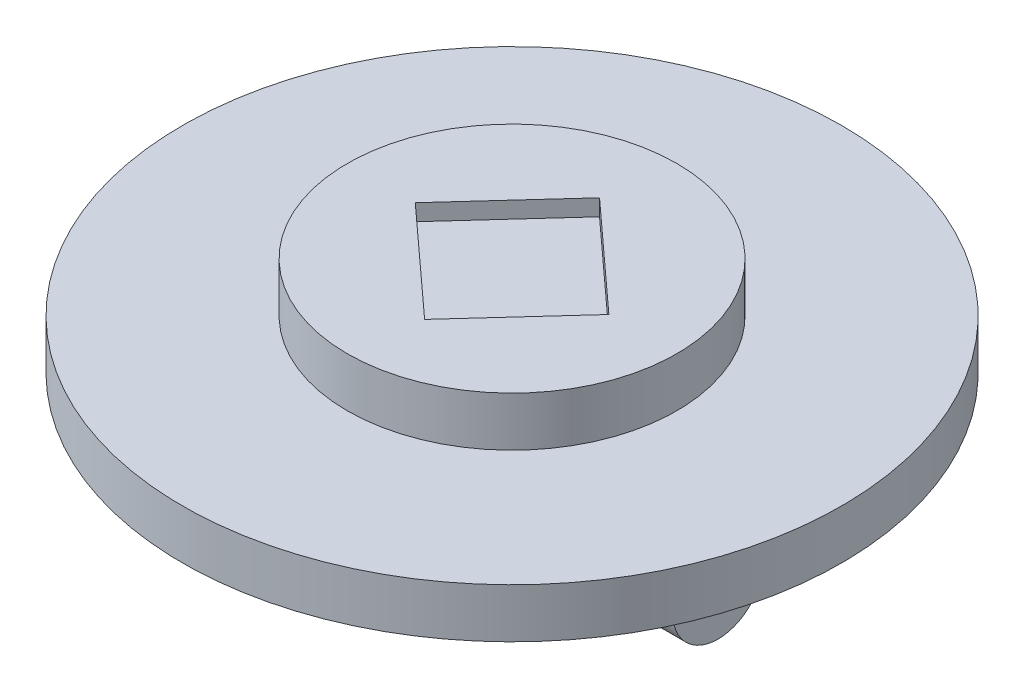
ISO-10303-21;
HEADER;
FILE_DESCRIPTION(('STEP AP214'),'2;1');
FILE_NAME('part.step','',(''),(''),'','','');
FILE_SCHEMA(('AUTOMOTIVE_DESIGN { 1 0 10303 214 1 1 1 1 }'));
ENDSEC;
DATA;
#1=APPLICATION_CONTEXT('core data for automotive mechanical design processes');
#2=APPLICATION_PROTOCOL_DEFINITION('international standard','automotive_design',2000,#1);
#3=PRODUCT_CONTEXT('',#1,'mechanical');
#4=PRODUCT('Part','Part','',(#3));
#5=PRODUCT_RELATED_PRODUCT_CATEGORY('part','',(#4));
#6=PRODUCT_DEFINITION_FORMATION('','',#4);
#7=PRODUCT_DEFINITION_CONTEXT('part definition',#1,'design');
#8=PRODUCT_DEFINITION('design','',#6,#7);
#9=PRODUCT_DEFINITION_SHAPE('','',#8);
#10=(LENGTH_UNIT() NAMED_UNIT(*) SI_UNIT(.MILLI.,.METRE.));
#11=(NAMED_UNIT(*) PLANE_ANGLE_UNIT() SI_UNIT($,.RADIAN.));
#12=(NAMED_UNIT(*) SI_UNIT($,.STERADIAN.) SOLID_ANGLE_UNIT());
#13=UNCERTAINTY_MEASURE_WITH_UNIT(LENGTH_MEASURE(1.E-05),#10,'distance_accuracy_value','');
#14=(GEOMETRIC_REPRESENTATION_CONTEXT(3) GLOBAL_UNCERTAINTY_ASSIGNED_CONTEXT((#13)) GLOBAL_UNIT_ASSIGNED_CONTEXT((#10,
#11,#12)) REPRESENTATION_CONTEXT('',''));
#15=CARTESIAN_POINT('',(0.,0.,0.));
#16=DIRECTION('',(0.,0.,1.));
#17=DIRECTION('',(1.,0.,0.));
#18=AXIS2_PLACEMENT_3D('',#15,#16,#17);
#19=CARTESIAN_POINT('',(0.,7.62,0.));
#20=DIRECTION('',(0.,1.,0.));
#21=DIRECTION('',(0.,0.,1.));
#22=AXIS2_PLACEMENT_3D('',#19,#20,#21);
#23=PLANE('',#22);
#24=CARTESIAN_POINT('',(0.,7.62,0.));
#25=DIRECTION('',(0.,1.,0.));
#26=DIRECTION('',(0.,0.,1.));
#27=AXIS2_PLACEMENT_3D('',#24,#25,#26);
#28=CIRCLE('',#27,50.8);
#29=CARTESIAN_POINT('',(0.,7.62,-50.8));
#30=VERTEX_POINT('',#29);
#31=EDGE_CURVE('E11',#30,#30,#28,.T.);
#32=ORIENTED_EDGE('',*,*,#31,.T.);
#33=EDGE_LOOP('',(#32));
#34=FACE_BOUND('',#33,.T.);
#35=CARTESIAN_POINT('',(0.,7.62,0.));
#36=DIRECTION('',(0.,1.,0.));
#37=DIRECTION('',(0.,0.,1.));
#38=AXIS2_PLACEMENT_3D('',#35,#36,#37);
#39=CIRCLE('',#38,25.4);
#40=CARTESIAN_POINT('',(0.,7.62,-25.4));
#41=VERTEX_POINT('',#40);
#42=EDGE_CURVE('E159',#41,#41,#39,.T.);
#43=ORIENTED_EDGE('',*,*,#42,.F.);
#44=EDGE_LOOP('',(#43));
#45=FACE_BOUND('',#44,.T.);
#46=ADVANCED_FACE('F35',(#34,#45),#23,.T.);
#47=CARTESIAN_POINT('',(0.,0.,0.));
#48=DIRECTION('',(0.,1.,0.));
#49=DIRECTION('',(0.,0.,1.));
#50=AXIS2_PLACEMENT_3D('',#47,#48,#49);
#51=PLANE('',#50);
#52=DIRECTION('',(0.,0.,1.));
#53=VECTOR('',#52,1.);
#54=CARTESIAN_POINT('',(-26.67,0.,-6.985));
#55=LINE('',#54,#53);
#56=CARTESIAN_POINT('',(-26.67,0.,-6.985));
#57=VERTEX_POINT('',#56);
#58=CARTESIAN_POINT('',(-26.67,0.,6.985));
#59=VERTEX_POINT('',#58);
#60=EDGE_CURVE('E217',#57,#59,#55,.T.);
#61=ORIENTED_EDGE('',*,*,#60,.F.);
#62=DIRECTION('',(1.,0.,0.));
#63=VECTOR('',#62,1.);
#64=CARTESIAN_POINT('',(-31.75,0.,-6.985));
#65=LINE('',#64,#63);
#66=CARTESIAN_POINT('',(-31.75,0.,-6.985));
#67=VERTEX_POINT('',#66);
#68=EDGE_CURVE('E224',#67,#57,#65,.T.);
#69=ORIENTED_EDGE('',*,*,#68,.F.);
#70=DIRECTION('',(0.,0.,-1.));
#71=VECTOR('',#70,1.);
#72=CARTESIAN_POINT('',(-31.75,0.,-6.985));
#73=LINE('',#72,#71);
#74=CARTESIAN_POINT('',(-31.75,0.,6.985));
#75=VERTEX_POINT('',#74);
#76=EDGE_CURVE('E233',#75,#67,#73,.T.);
#77=ORIENTED_EDGE('',*,*,#76,.F.);
#78=DIRECTION('',(-1.,0.,0.));
#79=VECTOR('',#78,1.);
#80=CARTESIAN_POINT('',(-31.75,0.,6.985));
#81=LINE('',#80,#79);
#82=EDGE_CURVE('E230',#59,#75,#81,.T.);
#83=ORIENTED_EDGE('',*,*,#82,.F.);
#84=EDGE_LOOP('',(#61,#69,#77,#83));
#85=FACE_BOUND('',#84,.T.);
#86=CARTESIAN_POINT('',(0.,0.,0.));
#87=DIRECTION('',(0.,1.,0.));
#88=DIRECTION('',(0.,0.,1.));
#89=AXIS2_PLACEMENT_3D('',#86,#87,#88);
#90=CIRCLE('',#89,50.8);
#91=CARTESIAN_POINT('',(0.,0.,-50.8));
#92=VERTEX_POINT('',#91);
#93=EDGE_CURVE('E39',#92,#92,#90,.T.);
#94=ORIENTED_EDGE('',*,*,#93,.F.);
#95=EDGE_LOOP('',(#94));
#96=FACE_BOUND('',#95,.T.);
#97=DIRECTION('',(0.,0.,1.));
#98=VECTOR('',#97,1.);
#99=CARTESIAN_POINT('',(31.75,0.,-6.985));
#100=LINE('',#99,#98);
#101=CARTESIAN_POINT('',(31.75,0.,-6.985));
#102=VERTEX_POINT('',#101);
#103=CARTESIAN_POINT('',(31.75,0.,6.985));
#104=VERTEX_POINT('',#103);
#105=EDGE_CURVE('E178',#102,#104,#100,.T.);
#106=ORIENTED_EDGE('',*,*,#105,.F.);
#107=DIRECTION('',(1.,0.,0.));
#108=VECTOR('',#107,1.);
#109=CARTESIAN_POINT('',(26.67,0.,-6.985));
#110=LINE('',#109,#108);
#111=CARTESIAN_POINT('',(26.67,0.,-6.985));
#112=VERTEX_POINT('',#111);
#113=EDGE_CURVE('E185',#112,#102,#110,.T.);
#114=ORIENTED_EDGE('',*,*,#113,.F.);
#115=DIRECTION('',(0.,0.,-1.));
#116=VECTOR('',#115,1.);
#117=CARTESIAN_POINT('',(26.67,0.,-6.985));
#118=LINE('',#117,#116);
#119=CARTESIAN_POINT('',(26.67,0.,6.985));
#120=VERTEX_POINT('',#119);
#121=EDGE_CURVE('E192',#120,#112,#118,.T.);
#122=ORIENTED_EDGE('',*,*,#121,.F.);
#123=DIRECTION('',(-1.,0.,0.));
#124=VECTOR('',#123,1.);
#125=CARTESIAN_POINT('',(26.67,0.,6.985));
#126=LINE('',#125,#124);
#127=EDGE_CURVE('E58',#104,#120,#126,.T.);
#128=ORIENTED_EDGE('',*,*,#127,.F.);
#129=EDGE_LOOP('',(#106,#114,#122,#128));
#130=FACE_BOUND('',#129,.T.);
#131=ADVANCED_FACE('F254',(#85,#96,#130),#51,.F.);
#132=CARTESIAN_POINT('',(0.,7.62,0.));
#133=DIRECTION('',(0.,-1.,0.));
#134=DIRECTION('',(0.,0.,-1.));
#135=AXIS2_PLACEMENT_3D('',#132,#133,#134);
#136=CYLINDRICAL_SURFACE('',#135,50.8);
#137=CARTESIAN_POINT('',(0.,7.62,-50.8));
#138=CARTESIAN_POINT('',(0.,7.540625,-50.8));
#139=CARTESIAN_POINT('',(0.,7.46125,-50.8));
#140=CARTESIAN_POINT('',(0.,7.3025,-50.8));
#141=CARTESIAN_POINT('',(0.,7.223125,-50.8));
#142=CARTESIAN_POINT('',(0.,7.064375,-50.8));
#143=CARTESIAN_POINT('',(0.,6.985,-50.8));
#144=CARTESIAN_POINT('',(0.,6.82625,-50.8));
#145=CARTESIAN_POINT('',(0.,6.746875,-50.8));
#146=CARTESIAN_POINT('',(0.,6.588125,-50.8));
#147=CARTESIAN_POINT('',(0.,6.50875,-50.8));
#148=CARTESIAN_POINT('',(0.,6.35,-50.8));
#149=CARTESIAN_POINT('',(0.,6.270625,-50.8));
#150=CARTESIAN_POINT('',(0.,6.111875,-50.8));
#151=CARTESIAN_POINT('',(0.,6.0325,-50.8));
#152=CARTESIAN_POINT('',(0.,5.87375,-50.8));
#153=CARTESIAN_POINT('',(0.,5.794375,-50.8));
#154=CARTESIAN_POINT('',(0.,5.635625,-50.8));
#155=CARTESIAN_POINT('',(0.,5.55625,-50.8));
#156=CARTESIAN_POINT('',(0.,5.3975,-50.8));
#157=CARTESIAN_POINT('',(0.,5.318125,-50.8));
#158=CARTESIAN_POINT('',(0.,5.159375,-50.8));
#159=CARTESIAN_POINT('',(0.,5.08,-50.8));
#160=CARTESIAN_POINT('',(0.,4.92125,-50.8));
#161=CARTESIAN_POINT('',(0.,4.841875,-50.8));
#162=CARTESIAN_POINT('',(0.,4.683125,-50.8));
#163=CARTESIAN_POINT('',(0.,4.60375,-50.8));
#164=CARTESIAN_POINT('',(0.,4.445,-50.8));
#165=CARTESIAN_POINT('',(0.,4.365625,-50.8));
#166=CARTESIAN_POINT('',(0.,4.206875,-50.8));
#167=CARTESIAN_POINT('',(0.,4.1275,-50.8));
#168=CARTESIAN_POINT('',(0.,3.96875,-50.8));
#169=CARTESIAN_POINT('',(0.,3.889375,-50.8));
#170=CARTESIAN_POINT('',(0.,3.730625,-50.8));
#171=CARTESIAN_POINT('',(0.,3.65125,-50.8));
#172=CARTESIAN_POINT('',(0.,3.4925,-50.8));
#173=CARTESIAN_POINT('',(0.,3.413125,-50.8));
#174=CARTESIAN_POINT('',(0.,3.254375,-50.8));
#175=CARTESIAN_POINT('',(0.,3.175,-50.8));
#176=CARTESIAN_POINT('',(0.,3.01625,-50.8));
#177=CARTESIAN_POINT('',(0.,2.936875,-50.8));
#178=CARTESIAN_POINT('',(0.,2.778125,-50.8));
#179=CARTESIAN_POINT('',(0.,2.69875,-50.8));
#180=CARTESIAN_POINT('',(0.,2.54,-50.8));
#181=CARTESIAN_POINT('',(0.,2.460625,-50.8));
#182=CARTESIAN_POINT('',(0.,2.301875,-50.8));
#183=CARTESIAN_POINT('',(0.,2.2225,-50.8));
#184=CARTESIAN_POINT('',(0.,2.06375,-50.8));
#185=CARTESIAN_POINT('',(0.,1.984375,-50.8));
#186=CARTESIAN_POINT('',(0.,1.825625,-50.8));
#187=CARTESIAN_POINT('',(0.,1.74625,-50.8));
#188=CARTESIAN_POINT('',(0.,1.5875,-50.8));
#189=CARTESIAN_POINT('',(0.,1.508125,-50.8));
#190=CARTESIAN_POINT('',(0.,1.349375,-50.8));
#191=CARTESIAN_POINT('',(0.,1.27,-50.8));
#192=CARTESIAN_POINT('',(0.,1.11125,-50.8));
#193=CARTESIAN_POINT('',(0.,1.031875,-50.8));
#194=CARTESIAN_POINT('',(0.,0.873125,-50.8));
#195=CARTESIAN_POINT('',(0.,0.79375,-50.8));
#196=CARTESIAN_POINT('',(0.,0.635,-50.8));
#197=CARTESIAN_POINT('',(0.,0.555625,-50.8));
#198=CARTESIAN_POINT('',(0.,0.396875,-50.8));
#199=CARTESIAN_POINT('',(0.,0.3175,-50.8));
#200=CARTESIAN_POINT('',(0.,0.15875,-50.8));
#201=CARTESIAN_POINT('',(0.,0.0793749999999999,-50.8));
#202=CARTESIAN_POINT('',(0.,0.,-50.8));
#203=B_SPLINE_CURVE_WITH_KNOTS('',3,(#137,#138,#139,#140,#141,#142,#143,#144,#145,#146,#147,
#148,#149,#150,#151,#152,#153,#154,#155,#156,#157,#158,#159,#160,#161,#162,#163,#164,#165,#166,
#167,#168,#169,#170,#171,#172,#173,#174,#175,#176,#177,#178,#179,#180,#181,#182,#183,#184,#185,
#186,#187,#188,#189,#190,#191,#192,#193,#194,#195,#196,#197,#198,#199,#200,#201,#202),
.UNSPECIFIED.,.F.,.F.,(4,2,2,2,2,2,2,2,2,2,2,2,2,2,2,2,2,2,2,2,2,2,2,2,2,2,2,2,2,2,2,2,4),(0.,
0.238125,0.476249999999999,0.714375,0.952499999999999,1.190625,1.42875,1.666875,1.905,2.143125,
2.38125,2.619375,2.8575,3.095625,3.33375,3.571875,3.81,4.048125,4.28625,4.524375,4.7625,
5.000625,5.23875,5.476875,5.715,5.953125,6.19125,6.429375,6.6675,6.905625,7.14375,7.381875,
7.62),.UNSPECIFIED.);
#204=EDGE_CURVE('BSEAM37',#30,#92,#203,.T.);
#205=ORIENTED_EDGE('',*,*,#31,.F.);
#206=ORIENTED_EDGE('',*,*,#93,.T.);
#207=ORIENTED_EDGE('',*,*,#204,.T.);
#208=ORIENTED_EDGE('',*,*,#204,.F.);
#209=EDGE_LOOP('',(#205,#207,#206,#208));
#210=FACE_BOUND('',#209,.T.);
#211=ADVANCED_FACE('F37',(#210),#136,.T.);
#212=CARTESIAN_POINT('',(-26.67,-12.7,-6.985));
#213=DIRECTION('',(-1.,0.,0.));
#214=DIRECTION('',(0.,0.,1.));
#215=AXIS2_PLACEMENT_3D('',#212,#213,#214);
#216=PLANE('',#215);
#217=CARTESIAN_POINT('',(-26.67,-12.7,0.));
#218=DIRECTION('',(-1.,0.,0.));
#219=DIRECTION('',(0.,0.,1.));
#220=AXIS2_PLACEMENT_3D('',#217,#218,#219);
#221=CIRCLE('',#220,2.516115174956);
#222=CARTESIAN_POINT('',(-26.67,-12.7,2.516115174956));
#223=VERTEX_POINT('',#222);
#224=EDGE_CURVE('E208',#223,#223,#221,.T.);
#225=ORIENTED_EDGE('',*,*,#224,.T.);
#226=EDGE_LOOP('',(#225));
#227=FACE_BOUND('',#226,.T.);
#228=DIRECTION('',(0.,1.,0.));
#229=VECTOR('',#228,1.);
#230=CARTESIAN_POINT('',(-26.67,-12.7,6.985));
#231=LINE('',#230,#229);
#232=CARTESIAN_POINT('',(-26.67,-12.7,6.985));
#233=VERTEX_POINT('',#232);
#234=EDGE_CURVE('E246',#233,#59,#231,.T.);
#235=ORIENTED_EDGE('',*,*,#234,.F.);
#236=CARTESIAN_POINT('',(-26.67,-12.7,0.));
#237=DIRECTION('',(-1.,0.,0.));
#238=DIRECTION('',(0.,0.,1.));
#239=AXIS2_PLACEMENT_3D('',#236,#237,#238);
#240=CIRCLE('',#239,6.985);
#241=CARTESIAN_POINT('',(-26.67,-12.7,-6.985));
#242=VERTEX_POINT('',#241);
#243=EDGE_CURVE('E214',#242,#233,#240,.T.);
#244=ORIENTED_EDGE('',*,*,#243,.F.);
#245=DIRECTION('',(0.,1.,0.));
#246=VECTOR('',#245,1.);
#247=CARTESIAN_POINT('',(-26.67,-12.7,-6.985));
#248=LINE('',#247,#246);
#249=EDGE_CURVE('E227',#242,#57,#248,.T.);
#250=ORIENTED_EDGE('',*,*,#249,.T.);
#251=ORIENTED_EDGE('',*,*,#60,.T.);
#252=EDGE_LOOP('',(#235,#244,#250,#251));
#253=FACE_BOUND('',#252,.T.);
#254=ADVANCED_FACE('F289',(#227,#253),#216,.F.);
#255=CARTESIAN_POINT('',(-31.75,-12.7,6.985));
#256=DIRECTION('',(0.,0.,-1.));
#257=DIRECTION('',(-1.,0.,0.));
#258=AXIS2_PLACEMENT_3D('',#255,#256,#257);
#259=PLANE('',#258);
#260=ORIENTED_EDGE('',*,*,#82,.T.);
#261=DIRECTION('',(0.,1.,0.));
#262=VECTOR('',#261,1.);
#263=CARTESIAN_POINT('',(-31.75,-12.7,6.985));
#264=LINE('',#263,#262);
#265=CARTESIAN_POINT('',(-31.75,-12.7,6.985));
#266=VERTEX_POINT('',#265);
#267=EDGE_CURVE('E243',#266,#75,#264,.T.);
#268=ORIENTED_EDGE('',*,*,#267,.F.);
#269=DIRECTION('',(-1.,0.,0.));
#270=VECTOR('',#269,1.);
#271=CARTESIAN_POINT('',(-31.75,-12.7,6.985));
#272=LINE('',#271,#270);
#273=EDGE_CURVE('E220',#233,#266,#272,.T.);
#274=ORIENTED_EDGE('',*,*,#273,.F.);
#275=ORIENTED_EDGE('',*,*,#234,.T.);
#276=EDGE_LOOP('',(#260,#268,#274,#275));
#277=FACE_BOUND('',#276,.T.);
#278=ADVANCED_FACE('F292',(#277),#259,.F.);
#279=CARTESIAN_POINT('',(-31.75,-12.7,-6.985));
#280=DIRECTION('',(1.,0.,0.));
#281=DIRECTION('',(0.,0.,-1.));
#282=AXIS2_PLACEMENT_3D('',#279,#280,#281);
#283=PLANE('',#282);
#284=CARTESIAN_POINT('',(-31.75,-12.7,0.));
#285=DIRECTION('',(-1.,0.,0.));
#286=DIRECTION('',(0.,0.,1.));
#287=AXIS2_PLACEMENT_3D('',#284,#285,#286);
#288=CIRCLE('',#287,2.516115174956);
#289=CARTESIAN_POINT('',(-31.75,-12.7,2.516115174956));
#290=VERTEX_POINT('',#289);
#291=EDGE_CURVE('E207',#290,#290,#288,.T.);
#292=ORIENTED_EDGE('',*,*,#291,.F.);
#293=EDGE_LOOP('',(#292));
#294=FACE_BOUND('',#293,.T.);
#295=DIRECTION('',(0.,1.,0.));
#296=VECTOR('',#295,1.);
#297=CARTESIAN_POINT('',(-31.75,-12.7,-6.985));
#298=LINE('',#297,#296);
#299=CARTESIAN_POINT('',(-31.75,-12.7,-6.985));
#300=VERTEX_POINT('',#299);
#301=EDGE_CURVE('E240',#300,#67,#298,.T.);
#302=ORIENTED_EDGE('',*,*,#301,.F.);
#303=CARTESIAN_POINT('',(-31.75,-12.7,0.));
#304=DIRECTION('',(-1.,0.,0.));
#305=DIRECTION('',(0.,0.,1.));
#306=AXIS2_PLACEMENT_3D('',#303,#304,#305);
#307=CIRCLE('',#306,6.985);
#308=EDGE_CURVE('E211',#300,#266,#307,.T.);
#309=ORIENTED_EDGE('',*,*,#308,.T.);
#310=ORIENTED_EDGE('',*,*,#267,.T.);
#311=ORIENTED_EDGE('',*,*,#76,.T.);
#312=EDGE_LOOP('',(#302,#309,#310,#311));
#313=FACE_BOUND('',#312,.T.);
#314=ADVANCED_FACE('F296',(#294,#313),#283,.F.);
#315=CARTESIAN_POINT('',(-31.75,-12.7,-6.985));
#316=DIRECTION('',(0.,0.,1.));
#317=DIRECTION('',(1.,0.,0.));
#318=AXIS2_PLACEMENT_3D('',#315,#316,#317);
#319=PLANE('',#318);
#320=ORIENTED_EDGE('',*,*,#68,.T.);
#321=ORIENTED_EDGE('',*,*,#249,.F.);
#322=DIRECTION('',(1.,0.,0.));
#323=VECTOR('',#322,1.);
#324=CARTESIAN_POINT('',(-31.75,-12.7,-6.985));
#325=LINE('',#324,#323);
#326=EDGE_CURVE('E223',#300,#242,#325,.T.);
#327=ORIENTED_EDGE('',*,*,#326,.F.);
#328=ORIENTED_EDGE('',*,*,#301,.T.);
#329=EDGE_LOOP('',(#320,#321,#327,#328));
#330=FACE_BOUND('',#329,.T.);
#331=ADVANCED_FACE('F299',(#330),#319,.F.);
#332=CARTESIAN_POINT('',(-26.67,-12.7,0.));
#333=DIRECTION('',(-1.,0.,0.));
#334=DIRECTION('',(0.,0.,1.));
#335=AXIS2_PLACEMENT_3D('',#332,#333,#334);
#336=CYLINDRICAL_SURFACE('',#335,6.985);
#337=ORIENTED_EDGE('',*,*,#326,.T.);
#338=ORIENTED_EDGE('',*,*,#243,.T.);
#339=ORIENTED_EDGE('',*,*,#273,.T.);
#340=ORIENTED_EDGE('',*,*,#308,.F.);
#341=EDGE_LOOP('',(#337,#338,#339,#340));
#342=FACE_BOUND('',#341,.T.);
#343=ADVANCED_FACE('F303',(#342),#336,.T.);
#344=CARTESIAN_POINT('',(-26.67,-12.7,0.));
#345=DIRECTION('',(-1.,0.,0.));
#346=DIRECTION('',(0.,0.,1.));
#347=AXIS2_PLACEMENT_3D('',#344,#345,#346);
#348=CYLINDRICAL_SURFACE('',#347,2.516115174956);
#349=ORIENTED_EDGE('',*,*,#224,.F.);
#350=EDGE_LOOP('',(#349));
#351=FACE_BOUND('',#350,.T.);
#352=ORIENTED_EDGE('',*,*,#291,.T.);
#353=EDGE_LOOP('',(#352));
#354=FACE_BOUND('',#353,.T.);
#355=ADVANCED_FACE('F279',(#351,#354),#348,.F.);
#356=CARTESIAN_POINT('',(31.75,-12.7,-6.985));
#357=DIRECTION('',(-1.,0.,0.));
#358=DIRECTION('',(0.,0.,1.));
#359=AXIS2_PLACEMENT_3D('',#356,#357,#358);
#360=PLANE('',#359);
#361=CARTESIAN_POINT('',(31.75,-12.7,0.));
#362=DIRECTION('',(1.,0.,0.));
#363=DIRECTION('',(0.,0.,-1.));
#364=AXIS2_PLACEMENT_3D('',#361,#362,#363);
#365=CIRCLE('',#364,2.54);
#366=CARTESIAN_POINT('',(31.75,-12.7,-2.54));
#367=VERTEX_POINT('',#366);
#368=EDGE_CURVE('E166',#367,#367,#365,.T.);
#369=ORIENTED_EDGE('',*,*,#368,.F.);
#370=EDGE_LOOP('',(#369));
#371=FACE_BOUND('',#370,.T.);
#372=DIRECTION('',(0.,1.,0.));
#373=VECTOR('',#372,1.);
#374=CARTESIAN_POINT('',(31.75,-12.7,6.985));
#375=LINE('',#374,#373);
#376=CARTESIAN_POINT('',(31.75,-12.7,6.985));
#377=VERTEX_POINT('',#376);
#378=EDGE_CURVE('E205',#377,#104,#375,.T.);
#379=ORIENTED_EDGE('',*,*,#378,.F.);
#380=CARTESIAN_POINT('',(31.75,-12.7,0.));
#381=DIRECTION('',(1.,0.,0.));
#382=DIRECTION('',(0.,0.,-1.));
#383=AXIS2_PLACEMENT_3D('',#380,#381,#382);
#384=CIRCLE('',#383,6.985);
#385=CARTESIAN_POINT('',(31.75,-12.7,-6.985));
#386=VERTEX_POINT('',#385);
#387=EDGE_CURVE('E172',#377,#386,#384,.T.);
#388=ORIENTED_EDGE('',*,*,#387,.T.);
#389=DIRECTION('',(0.,1.,0.));
#390=VECTOR('',#389,1.);
#391=CARTESIAN_POINT('',(31.75,-12.7,-6.985));
#392=LINE('',#391,#390);
#393=EDGE_CURVE('E188',#386,#102,#392,.T.);
#394=ORIENTED_EDGE('',*,*,#393,.T.);
#395=ORIENTED_EDGE('',*,*,#105,.T.);
#396=EDGE_LOOP('',(#379,#388,#394,#395));
#397=FACE_BOUND('',#396,.T.);
#398=ADVANCED_FACE('F261',(#371,#397),#360,.F.);
#399=CARTESIAN_POINT('',(26.67,-12.7,6.985));
#400=DIRECTION('',(0.,0.,-1.));
#401=DIRECTION('',(-1.,0.,0.));
#402=AXIS2_PLACEMENT_3D('',#399,#400,#401);
#403=PLANE('',#402);
#404=ORIENTED_EDGE('',*,*,#127,.T.);
#405=DIRECTION('',(0.,1.,0.));
#406=VECTOR('',#405,1.);
#407=CARTESIAN_POINT('',(26.67,-12.7,6.985));
#408=LINE('',#407,#406);
#409=CARTESIAN_POINT('',(26.67,-12.7,6.985));
#410=VERTEX_POINT('',#409);
#411=EDGE_CURVE('E202',#410,#120,#408,.T.);
#412=ORIENTED_EDGE('',*,*,#411,.F.);
#413=DIRECTION('',(-1.,0.,0.));
#414=VECTOR('',#413,1.);
#415=CARTESIAN_POINT('',(26.67,-12.7,6.985));
#416=LINE('',#415,#414);
#417=EDGE_CURVE('E181',#377,#410,#416,.T.);
#418=ORIENTED_EDGE('',*,*,#417,.F.);
#419=ORIENTED_EDGE('',*,*,#378,.T.);
#420=EDGE_LOOP('',(#404,#412,#418,#419));
#421=FACE_BOUND('',#420,.T.);
#422=ADVANCED_FACE('F270',(#421),#403,.F.);
#423=CARTESIAN_POINT('',(26.67,-12.7,-6.985));
#424=DIRECTION('',(1.,0.,0.));
#425=DIRECTION('',(0.,0.,-1.));
#426=AXIS2_PLACEMENT_3D('',#423,#424,#425);
#427=PLANE('',#426);
#428=CARTESIAN_POINT('',(26.67,-12.7,0.));
#429=DIRECTION('',(1.,0.,0.));
#430=DIRECTION('',(0.,0.,-1.));
#431=AXIS2_PLACEMENT_3D('',#428,#429,#430);
#432=CIRCLE('',#431,2.54);
#433=CARTESIAN_POINT('',(26.67,-12.7,-2.54));
#434=VERTEX_POINT('',#433);
#435=EDGE_CURVE('E169',#434,#434,#432,.T.);
#436=ORIENTED_EDGE('',*,*,#435,.T.);
#437=EDGE_LOOP('',(#436));
#438=FACE_BOUND('',#437,.T.);
#439=DIRECTION('',(0.,1.,0.));
#440=VECTOR('',#439,1.);
#441=CARTESIAN_POINT('',(26.67,-12.7,-6.985));
#442=LINE('',#441,#440);
#443=CARTESIAN_POINT('',(26.67,-12.7,-6.985));
#444=VERTEX_POINT('',#443);
#445=EDGE_CURVE('E199',#444,#112,#442,.T.);
#446=ORIENTED_EDGE('',*,*,#445,.F.);
#447=CARTESIAN_POINT('',(26.67,-12.7,0.));
#448=DIRECTION('',(1.,0.,0.));
#449=DIRECTION('',(0.,0.,-1.));
#450=AXIS2_PLACEMENT_3D('',#447,#448,#449);
#451=CIRCLE('',#450,6.985);
#452=EDGE_CURVE('E175',#410,#444,#451,.T.);
#453=ORIENTED_EDGE('',*,*,#452,.F.);
#454=ORIENTED_EDGE('',*,*,#411,.T.);
#455=ORIENTED_EDGE('',*,*,#121,.T.);
#456=EDGE_LOOP('',(#446,#453,#454,#455));
#457=FACE_BOUND('',#456,.T.);
#458=ADVANCED_FACE('F268',(#438,#457),#427,.F.);
#459=CARTESIAN_POINT('',(26.67,-12.7,-6.985));
#460=DIRECTION('',(0.,0.,1.));
#461=DIRECTION('',(1.,0.,0.));
#462=AXIS2_PLACEMENT_3D('',#459,#460,#461);
#463=PLANE('',#462);
#464=ORIENTED_EDGE('',*,*,#113,.T.);
#465=ORIENTED_EDGE('',*,*,#393,.F.);
#466=DIRECTION('',(1.,0.,0.));
#467=VECTOR('',#466,1.);
#468=CARTESIAN_POINT('',(26.67,-12.7,-6.985));
#469=LINE('',#468,#467);
#470=EDGE_CURVE('E184',#444,#386,#469,.T.);
#471=ORIENTED_EDGE('',*,*,#470,.F.);
#472=ORIENTED_EDGE('',*,*,#445,.T.);
#473=EDGE_LOOP('',(#464,#465,#471,#472));
#474=FACE_BOUND('',#473,.T.);
#475=ADVANCED_FACE('F259',(#474),#463,.F.);
#476=CARTESIAN_POINT('',(26.67,-12.7,0.));
#477=DIRECTION('',(1.,0.,0.));
#478=DIRECTION('',(0.,0.,-1.));
#479=AXIS2_PLACEMENT_3D('',#476,#477,#478);
#480=CYLINDRICAL_SURFACE('',#479,6.985);
#481=ORIENTED_EDGE('',*,*,#417,.T.);
#482=ORIENTED_EDGE('',*,*,#452,.T.);
#483=ORIENTED_EDGE('',*,*,#470,.T.);
#484=ORIENTED_EDGE('',*,*,#387,.F.);
#485=EDGE_LOOP('',(#481,#482,#483,#484));
#486=FACE_BOUND('',#485,.T.);
#487=ADVANCED_FACE('F265',(#486),#480,.T.);
#488=CARTESIAN_POINT('',(26.67,-12.7,0.));
#489=DIRECTION('',(1.,0.,0.));
#490=DIRECTION('',(0.,0.,-1.));
#491=AXIS2_PLACEMENT_3D('',#488,#489,#490);
#492=CYLINDRICAL_SURFACE('',#491,2.54);
#493=ORIENTED_EDGE('',*,*,#435,.F.);
#494=EDGE_LOOP('',(#493));
#495=FACE_BOUND('',#494,.T.);
#496=ORIENTED_EDGE('',*,*,#368,.T.);
#497=EDGE_LOOP('',(#496));
#498=FACE_BOUND('',#497,.T.);
#499=ADVANCED_FACE('F348',(#495,#498),#492,.F.);
#500=CARTESIAN_POINT('',(0.,15.24,0.));
#501=DIRECTION('',(0.,-1.,0.));
#502=DIRECTION('',(0.,0.,-1.));
#503=AXIS2_PLACEMENT_3D('',#500,#501,#502);
#504=CYLINDRICAL_SURFACE('',#503,25.4);
#505=CARTESIAN_POINT('',(0.,15.24,0.));
#506=DIRECTION('',(0.,1.,0.));
#507=DIRECTION('',(0.,0.,1.));
#508=AXIS2_PLACEMENT_3D('',#505,#506,#507);
#509=CIRCLE('',#508,25.4);
#510=CARTESIAN_POINT('',(0.,15.24,-25.4));
#511=VERTEX_POINT('',#510);
#512=EDGE_CURVE('E163',#511,#511,#509,.T.);
#513=CARTESIAN_POINT('',(0.,15.24,-25.4));
#514=CARTESIAN_POINT('',(0.,15.160625,-25.4));
#515=CARTESIAN_POINT('',(0.,15.08125,-25.4));
#516=CARTESIAN_POINT('',(0.,14.9225,-25.4));
#517=CARTESIAN_POINT('',(0.,14.843125,-25.4));
#518=CARTESIAN_POINT('',(0.,14.684375,-25.4));
#519=CARTESIAN_POINT('',(0.,14.605,-25.4));
#520=CARTESIAN_POINT('',(0.,14.44625,-25.4));
#521=CARTESIAN_POINT('',(0.,14.366875,-25.4));
#522=CARTESIAN_POINT('',(0.,14.208125,-25.4));
#523=CARTESIAN_POINT('',(0.,14.12875,-25.4));
#524=CARTESIAN_POINT('',(0.,13.97,-25.4));
#525=CARTESIAN_POINT('',(0.,13.890625,-25.4));
#526=CARTESIAN_POINT('',(0.,13.731875,-25.4));
#527=CARTESIAN_POINT('',(0.,13.6525,-25.4));
#528=CARTESIAN_POINT('',(0.,13.49375,-25.4));
#529=CARTESIAN_POINT('',(0.,13.414375,-25.4));
#530=CARTESIAN_POINT('',(0.,13.255625,-25.4));
#531=CARTESIAN_POINT('',(0.,13.17625,-25.4));
#532=CARTESIAN_POINT('',(0.,13.0175,-25.4));
#533=CARTESIAN_POINT('',(0.,12.938125,-25.4));
#534=CARTESIAN_POINT('',(0.,12.779375,-25.4));
#535=CARTESIAN_POINT('',(0.,12.7,-25.4));
#536=CARTESIAN_POINT('',(0.,12.54125,-25.4));
#537=CARTESIAN_POINT('',(0.,12.461875,-25.4));
#538=CARTESIAN_POINT('',(0.,12.303125,-25.4));
#539=CARTESIAN_POINT('',(0.,12.22375,-25.4));
#540=CARTESIAN_POINT('',(0.,12.065,-25.4));
#541=CARTESIAN_POINT('',(0.,11.985625,-25.4));
#542=CARTESIAN_POINT('',(0.,11.826875,-25.4));
#543=CARTESIAN_POINT('',(0.,11.7475,-25.4));
#544=CARTESIAN_POINT('',(0.,11.58875,-25.4));
#545=CARTESIAN_POINT('',(0.,11.509375,-25.4));
#546=CARTESIAN_POINT('',(0.,11.350625,-25.4));
#547=CARTESIAN_POINT('',(0.,11.27125,-25.4));
#548=CARTESIAN_POINT('',(0.,11.1125,-25.4));
#549=CARTESIAN_POINT('',(0.,11.033125,-25.4));
#550=CARTESIAN_POINT('',(0.,10.874375,-25.4));
#551=CARTESIAN_POINT('',(0.,10.795,-25.4));
#552=CARTESIAN_POINT('',(0.,10.63625,-25.4));
#553=CARTESIAN_POINT('',(0.,10.556875,-25.4));
#554=CARTESIAN_POINT('',(0.,10.398125,-25.4));
#555=CARTESIAN_POINT('',(0.,10.31875,-25.4));
#556=CARTESIAN_POINT('',(0.,10.16,-25.4));
#557=CARTESIAN_POINT('',(0.,10.080625,-25.4));
#558=CARTESIAN_POINT('',(0.,9.921875,-25.4));
#559=CARTESIAN_POINT('',(0.,9.8425,-25.4));
#560=CARTESIAN_POINT('',(0.,9.68375,-25.4));
#561=CARTESIAN_POINT('',(0.,9.604375,-25.4));
#562=CARTESIAN_POINT('',(0.,9.445625,-25.4));
#563=CARTESIAN_POINT('',(0.,9.36625,-25.4));
#564=CARTESIAN_POINT('',(0.,9.2075,-25.4));
#565=CARTESIAN_POINT('',(0.,9.128125,-25.4));
#566=CARTESIAN_POINT('',(0.,8.969375,-25.4));
#567=CARTESIAN_POINT('',(0.,8.89,-25.4));
#568=CARTESIAN_POINT('',(0.,8.73125,-25.4));
#569=CARTESIAN_POINT('',(0.,8.651875,-25.4));
#570=CARTESIAN_POINT('',(0.,8.493125,-25.4));
#571=CARTESIAN_POINT('',(0.,8.41375,-25.4));
#572=CARTESIAN_POINT('',(0.,8.255,-25.4));
#573=CARTESIAN_POINT('',(0.,8.175625,-25.4));
#574=CARTESIAN_POINT('',(0.,8.016875,-25.4));
#575=CARTESIAN_POINT('',(0.,7.9375,-25.4));
#576=CARTESIAN_POINT('',(0.,7.77875,-25.4));
#577=CARTESIAN_POINT('',(0.,7.699375,-25.4));
#578=CARTESIAN_POINT('',(0.,7.62,-25.4));
#579=B_SPLINE_CURVE_WITH_KNOTS('',3,(#513,#514,#515,#516,#517,#518,#519,#520,#521,#522,#523,
#524,#525,#526,#527,#528,#529,#530,#531,#532,#533,#534,#535,#536,#537,#538,#539,#540,#541,#542,
#543,#544,#545,#546,#547,#548,#549,#550,#551,#552,#553,#554,#555,#556,#557,#558,#559,#560,#561,
#562,#563,#564,#565,#566,#567,#568,#569,#570,#571,#572,#573,#574,#575,#576,#577,#578),
.UNSPECIFIED.,.F.,.F.,(4,2,2,2,2,2,2,2,2,2,2,2,2,2,2,2,2,2,2,2,2,2,2,2,2,2,2,2,2,2,2,2,4),(0.,
0.238124999999999,0.476249999999999,0.714375,0.952499999999998,1.190625,1.42875,1.666875,1.905,
2.143125,2.38125,2.619375,2.8575,3.095625,3.33375,3.571875,3.81,4.048125,4.28625,4.524375,
4.7625,5.000625,5.23875,5.476875,5.715,5.953125,6.19125,6.429375,6.6675,6.905625,7.14375,
7.381875,7.62),.UNSPECIFIED.);
#580=EDGE_CURVE('BSEAM352',#511,#41,#579,.T.);
#581=ORIENTED_EDGE('',*,*,#512,.F.);
#582=ORIENTED_EDGE('',*,*,#42,.T.);
#583=ORIENTED_EDGE('',*,*,#580,.T.);
#584=ORIENTED_EDGE('',*,*,#580,.F.);
#585=EDGE_LOOP('',(#581,#583,#582,#584));
#586=FACE_BOUND('',#585,.T.);
#587=ADVANCED_FACE('F352',(#586),#504,.T.);
#588=CARTESIAN_POINT('',(0.,15.24,0.));
#589=DIRECTION('',(0.,1.,0.));
#590=DIRECTION('',(0.,0.,1.));
#591=AXIS2_PLACEMENT_3D('',#588,#589,#590);
#592=PLANE('',#591);
#593=DIRECTION('',(0.673649473387308,0.,-0.739051004332585));
#594=VECTOR('',#593,1.);
#595=CARTESIAN_POINT('',(1.37873117016431,15.24,14.8586710916696));
#596=LINE('',#595,#594);
#597=CARTESIAN_POINT('',(1.37873117016431,15.24,14.8586710916696));
#598=VERTEX_POINT('',#597);
#599=CARTESIAN_POINT('',(14.9225,15.24,0.));
#600=VERTEX_POINT('',#599);
#601=EDGE_CURVE('E50',#598,#600,#596,.T.);
#602=ORIENTED_EDGE('',*,*,#601,.F.);
#603=DIRECTION('',(0.739051004332585,0.,0.673649473387308));
#604=VECTOR('',#603,1.);
#605=CARTESIAN_POINT('',(1.37873117016431,15.24,14.8586710916696));
#606=LINE('',#605,#604);
#607=CARTESIAN_POINT('',(-14.9225,15.24,0.));
#608=VERTEX_POINT('',#607);
#609=EDGE_CURVE('E144',#608,#598,#606,.T.);
#610=ORIENTED_EDGE('',*,*,#609,.F.);
#611=DIRECTION('',(-0.673649473387308,0.,0.739051004332585));
#612=VECTOR('',#611,1.);
#613=CARTESIAN_POINT('',(-14.9225,15.24,0.));
#614=LINE('',#613,#612);
#615=CARTESIAN_POINT('',(-1.37873117016431,15.24,-14.8586710916696));
#616=VERTEX_POINT('',#615);
#617=EDGE_CURVE('E147',#616,#608,#614,.T.);
#618=ORIENTED_EDGE('',*,*,#617,.F.);
#619=DIRECTION('',(-0.739051004332585,0.,-0.673649473387308));
#620=VECTOR('',#619,1.);
#621=CARTESIAN_POINT('',(14.9225,15.24,0.));
#622=LINE('',#621,#620);
#623=EDGE_CURVE('E153',#600,#616,#622,.T.);
#624=ORIENTED_EDGE('',*,*,#623,.F.);
#625=EDGE_LOOP('',(#602,#610,#618,#624));
#626=FACE_BOUND('',#625,.T.);
#627=ORIENTED_EDGE('',*,*,#512,.T.);
#628=EDGE_LOOP('',(#627));
#629=FACE_BOUND('',#628,.T.);
#630=ADVANCED_FACE('F367',(#626,#629),#592,.T.);
#631=CARTESIAN_POINT('',(1.37873117016431,12.7,14.8586710916696));
#632=DIRECTION('',(0.739051004332585,0.,0.673649473387308));
#633=DIRECTION('',(0.673649473387308,0.,-0.739051004332585));
#634=AXIS2_PLACEMENT_3D('',#631,#632,#633);
#635=PLANE('',#634);
#636=ORIENTED_EDGE('',*,*,#601,.T.);
#637=DIRECTION('',(0.,1.,0.));
#638=VECTOR('',#637,1.);
#639=CARTESIAN_POINT('',(14.9225,12.7,0.));
#640=LINE('',#639,#638);
#641=CARTESIAN_POINT('',(14.9225,12.7,0.));
#642=VERTEX_POINT('',#641);
#643=EDGE_CURVE('E122',#642,#600,#640,.T.);
#644=ORIENTED_EDGE('',*,*,#643,.F.);
#645=DIRECTION('',(0.673649473387308,0.,-0.739051004332585));
#646=VECTOR('',#645,1.);
#647=CARTESIAN_POINT('',(1.37873117016431,12.7,14.8586710916696));
#648=LINE('',#647,#646);
#649=CARTESIAN_POINT('',(1.37873117016431,12.7,14.8586710916696));
#650=VERTEX_POINT('',#649);
#651=EDGE_CURVE('E126',#650,#642,#648,.T.);
#652=ORIENTED_EDGE('',*,*,#651,.F.);
#653=DIRECTION('',(0.,1.,0.));
#654=VECTOR('',#653,1.);
#655=CARTESIAN_POINT('',(1.37873117016431,12.7,14.8586710916696));
#656=LINE('',#655,#654);
#657=EDGE_CURVE('E157',#650,#598,#656,.T.);
#658=ORIENTED_EDGE('',*,*,#657,.T.);
#659=EDGE_LOOP('',(#636,#644,#652,#658));
#660=FACE_BOUND('',#659,.T.);
#661=ADVANCED_FACE('F124',(#660),#635,.F.);
#662=CARTESIAN_POINT('',(1.37873117016431,12.7,14.8586710916696));
#663=DIRECTION('',(-0.673649473387308,0.,0.739051004332585));
#664=DIRECTION('',(0.739051004332585,0.,0.673649473387308));
#665=AXIS2_PLACEMENT_3D('',#662,#663,#664);
#666=PLANE('',#665);
#667=ORIENTED_EDGE('',*,*,#609,.T.);
#668=ORIENTED_EDGE('',*,*,#657,.F.);
#669=DIRECTION('',(0.739051004332585,0.,0.673649473387308));
#670=VECTOR('',#669,1.);
#671=CARTESIAN_POINT('',(1.37873117016431,12.7,14.8586710916696));
#672=LINE('',#671,#670);
#673=CARTESIAN_POINT('',(-14.9225,12.7,0.));
#674=VERTEX_POINT('',#673);
#675=EDGE_CURVE('E132',#674,#650,#672,.T.);
#676=ORIENTED_EDGE('',*,*,#675,.F.);
#677=DIRECTION('',(0.,1.,0.));
#678=VECTOR('',#677,1.);
#679=CARTESIAN_POINT('',(-14.9225,12.7,0.));
#680=LINE('',#679,#678);
#681=EDGE_CURVE('E160',#674,#608,#680,.T.);
#682=ORIENTED_EDGE('',*,*,#681,.T.);
#683=EDGE_LOOP('',(#667,#668,#676,#682));
#684=FACE_BOUND('',#683,.T.);
#685=ADVANCED_FACE('F386',(#684),#666,.F.);
#686=CARTESIAN_POINT('',(-14.9225,12.7,0.));
#687=DIRECTION('',(-0.739051004332585,0.,-0.673649473387308));
#688=DIRECTION('',(-0.673649473387308,0.,0.739051004332585));
#689=AXIS2_PLACEMENT_3D('',#686,#687,#688);
#690=PLANE('',#689);
#691=ORIENTED_EDGE('',*,*,#617,.T.);
#692=ORIENTED_EDGE('',*,*,#681,.F.);
#693=DIRECTION('',(-0.673649473387308,0.,0.739051004332585));
#694=VECTOR('',#693,1.);
#695=CARTESIAN_POINT('',(-14.9225,12.7,0.));
#696=LINE('',#695,#694);
#697=CARTESIAN_POINT('',(-1.37873117016431,12.7,-14.8586710916696));
#698=VERTEX_POINT('',#697);
#699=EDGE_CURVE('E140',#698,#674,#696,.T.);
#700=ORIENTED_EDGE('',*,*,#699,.F.);
#701=DIRECTION('',(0.,1.,0.));
#702=VECTOR('',#701,1.);
#703=CARTESIAN_POINT('',(-1.37873117016431,12.7,-14.8586710916696));
#704=LINE('',#703,#702);
#705=EDGE_CURVE('E131',#698,#616,#704,.T.);
#706=ORIENTED_EDGE('',*,*,#705,.T.);
#707=EDGE_LOOP('',(#691,#692,#700,#706));
#708=FACE_BOUND('',#707,.T.);
#709=ADVANCED_FACE('F395',(#708),#690,.F.);
#710=CARTESIAN_POINT('',(14.9225,12.7,0.));
#711=DIRECTION('',(0.673649473387308,0.,-0.739051004332585));
#712=DIRECTION('',(-0.739051004332585,0.,-0.673649473387308));
#713=AXIS2_PLACEMENT_3D('',#710,#711,#712);
#714=PLANE('',#713);
#715=ORIENTED_EDGE('',*,*,#623,.T.);
#716=ORIENTED_EDGE('',*,*,#705,.F.);
#717=DIRECTION('',(-0.739051004332585,0.,-0.673649473387308));
#718=VECTOR('',#717,1.);
#719=CARTESIAN_POINT('',(14.9225,12.7,0.));
#720=LINE('',#719,#718);
#721=EDGE_CURVE('E135',#642,#698,#720,.T.);
#722=ORIENTED_EDGE('',*,*,#721,.F.);
#723=ORIENTED_EDGE('',*,*,#643,.T.);
#724=EDGE_LOOP('',(#715,#716,#722,#723));
#725=FACE_BOUND('',#724,.T.);
#726=ADVANCED_FACE('F136',(#725),#714,.F.);
#727=CARTESIAN_POINT('',(0.,12.7,0.));
#728=DIRECTION('',(0.,1.,0.));
#729=DIRECTION('',(0.,0.,1.));
#730=AXIS2_PLACEMENT_3D('',#727,#728,#729);
#731=PLANE('',#730);
#732=ORIENTED_EDGE('',*,*,#651,.T.);
#733=ORIENTED_EDGE('',*,*,#721,.T.);
#734=ORIENTED_EDGE('',*,*,#699,.T.);
#735=ORIENTED_EDGE('',*,*,#675,.T.);
#736=EDGE_LOOP('',(#732,#733,#734,#735));
#737=FACE_BOUND('',#736,.T.);
#738=ADVANCED_FACE('F142',(#737),#731,.T.);
#739=CLOSED_SHELL('',(#46,#131,#211,#254,#278,#314,#331,#343,#355,#398,#422,#458,#475,#487,#499,
#587,#630,#661,#685,#709,#726,#738));
#740=MANIFOLD_SOLID_BREP('B2',#739);
#741=ADVANCED_BREP_SHAPE_REPRESENTATION('',(#18,#740),#14);
#742=SHAPE_DEFINITION_REPRESENTATION(#9,#741);
ENDSEC;
END-ISO-10303-21;
